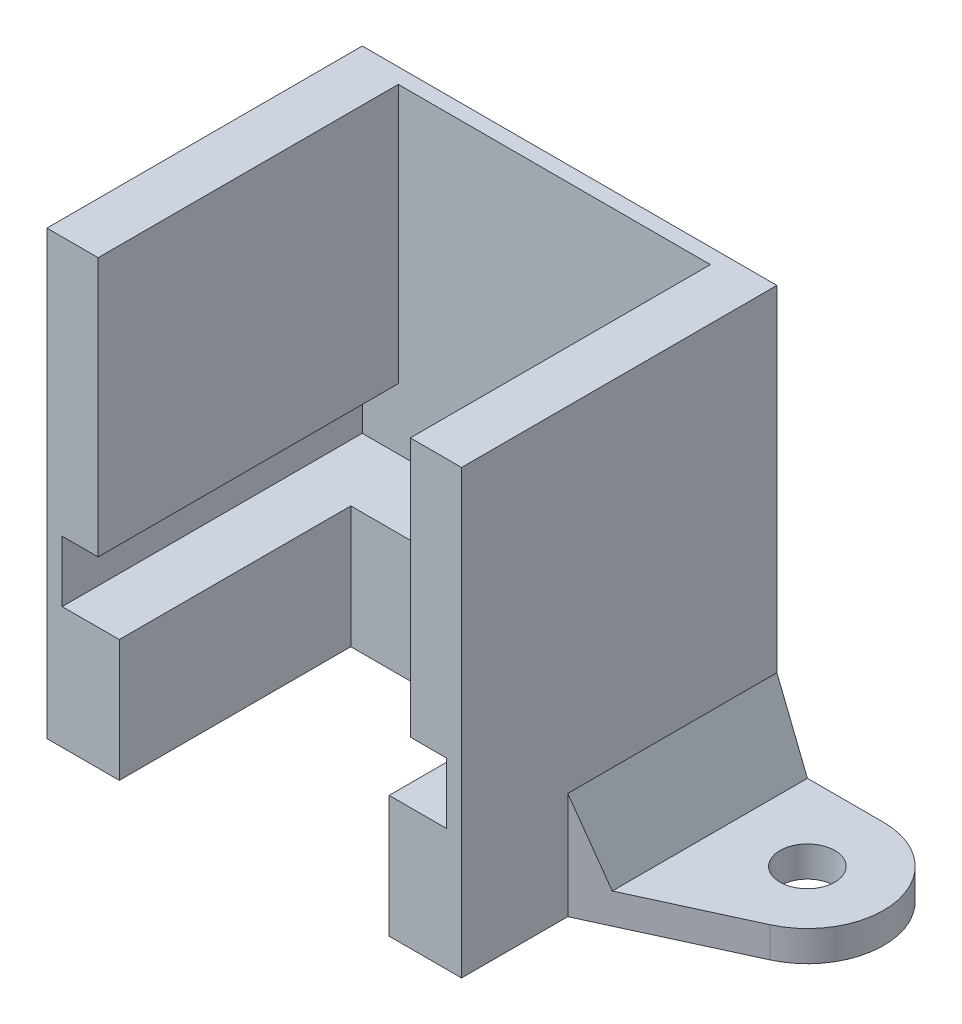
ISO-10303-21;
HEADER;
FILE_DESCRIPTION(('STEP AP214'),'2;1');
FILE_NAME('part.step','',(''),(''),'','','');
FILE_SCHEMA(('AUTOMOTIVE_DESIGN { 1 0 10303 214 1 1 1 1 }'));
ENDSEC;
DATA;
#1=APPLICATION_CONTEXT('core data for automotive mechanical design processes');
#2=APPLICATION_PROTOCOL_DEFINITION('international standard','automotive_design',2000,#1);
#3=PRODUCT_CONTEXT('',#1,'mechanical');
#4=PRODUCT('Part','Part','',(#3));
#5=PRODUCT_RELATED_PRODUCT_CATEGORY('part','',(#4));
#6=PRODUCT_DEFINITION_FORMATION('','',#4);
#7=PRODUCT_DEFINITION_CONTEXT('part definition',#1,'design');
#8=PRODUCT_DEFINITION('design','',#6,#7);
#9=PRODUCT_DEFINITION_SHAPE('','',#8);
#10=(LENGTH_UNIT() NAMED_UNIT(*) SI_UNIT(.MILLI.,.METRE.));
#11=(NAMED_UNIT(*) PLANE_ANGLE_UNIT() SI_UNIT($,.RADIAN.));
#12=(NAMED_UNIT(*) SI_UNIT($,.STERADIAN.) SOLID_ANGLE_UNIT());
#13=UNCERTAINTY_MEASURE_WITH_UNIT(LENGTH_MEASURE(1.E-05),#10,'distance_accuracy_value','');
#14=(GEOMETRIC_REPRESENTATION_CONTEXT(3) GLOBAL_UNCERTAINTY_ASSIGNED_CONTEXT((#13)) GLOBAL_UNIT_ASSIGNED_CONTEXT((#10,
#11,#12)) REPRESENTATION_CONTEXT('',''));
#15=CARTESIAN_POINT('',(0.,0.,0.));
#16=DIRECTION('',(0.,0.,1.));
#17=DIRECTION('',(1.,0.,0.));
#18=AXIS2_PLACEMENT_3D('',#15,#16,#17);
#19=CARTESIAN_POINT('',(0.,0.,0.234999999999994));
#20=DIRECTION('',(0.,0.,1.));
#21=DIRECTION('',(1.,0.,0.));
#22=AXIS2_PLACEMENT_3D('',#19,#20,#21);
#23=PLANE('',#22);
#24=DIRECTION('',(0.,-1.,0.));
#25=VECTOR('',#24,1.);
#26=CARTESIAN_POINT('',(-17.27,10.16,0.234999999999996));
#27=LINE('',#26,#25);
#28=CARTESIAN_POINT('',(-17.27,36.83,0.234999999999985));
#29=VERTEX_POINT('',#28);
#30=CARTESIAN_POINT('',(-17.27,0.,0.234999999999989));
#31=VERTEX_POINT('',#30);
#32=EDGE_CURVE('E399',#29,#31,#27,.T.);
#33=ORIENTED_EDGE('',*,*,#32,.T.);
#34=DIRECTION('',(1.,0.,0.));
#35=VECTOR('',#34,1.);
#36=CARTESIAN_POINT('',(0.,0.,0.234999999999994));
#37=LINE('',#36,#35);
#38=CARTESIAN_POINT('',(-11.2395,0.,0.234999999999996));
#39=VERTEX_POINT('',#38);
#40=EDGE_CURVE('E401',#31,#39,#37,.T.);
#41=ORIENTED_EDGE('',*,*,#40,.T.);
#42=DIRECTION('',(0.,-1.,0.));
#43=VECTOR('',#42,1.);
#44=CARTESIAN_POINT('',(-11.2395,10.16,0.234999999999996));
#45=LINE('',#44,#43);
#46=CARTESIAN_POINT('',(-11.2395,10.16,0.234999999999996));
#47=VERTEX_POINT('',#46);
#48=EDGE_CURVE('E389',#47,#39,#45,.T.);
#49=ORIENTED_EDGE('',*,*,#48,.F.);
#50=DIRECTION('',(1.,0.,0.));
#51=VECTOR('',#50,1.);
#52=CARTESIAN_POINT('',(0.,10.16,0.234999999999994));
#53=LINE('',#52,#51);
#54=CARTESIAN_POINT('',(-16.,10.16,0.234999999999992));
#55=VERTEX_POINT('',#54);
#56=EDGE_CURVE('E394',#55,#47,#53,.T.);
#57=ORIENTED_EDGE('',*,*,#56,.F.);
#58=DIRECTION('',(0.,-1.,0.));
#59=VECTOR('',#58,1.);
#60=CARTESIAN_POINT('',(-16.,15.24,0.234999999999992));
#61=LINE('',#60,#59);
#62=CARTESIAN_POINT('',(-16.,15.24,0.234999999999992));
#63=VERTEX_POINT('',#62);
#64=EDGE_CURVE('E240',#63,#55,#61,.T.);
#65=ORIENTED_EDGE('',*,*,#64,.F.);
#66=DIRECTION('',(1.,0.,0.));
#67=VECTOR('',#66,1.);
#68=CARTESIAN_POINT('',(0.,15.24,0.234999999999994));
#69=LINE('',#68,#67);
#70=CARTESIAN_POINT('',(-13.,15.24,0.234999999999985));
#71=VERTEX_POINT('',#70);
#72=EDGE_CURVE('E245',#63,#71,#69,.T.);
#73=ORIENTED_EDGE('',*,*,#72,.T.);
#74=DIRECTION('',(0.,-1.,0.));
#75=VECTOR('',#74,1.);
#76=CARTESIAN_POINT('',(-13.,36.83,0.234999999999992));
#77=LINE('',#76,#75);
#78=CARTESIAN_POINT('',(-13.,36.83,0.234999999999985));
#79=VERTEX_POINT('',#78);
#80=EDGE_CURVE('E383',#79,#71,#77,.T.);
#81=ORIENTED_EDGE('',*,*,#80,.F.);
#82=DIRECTION('',(1.,0.,0.));
#83=VECTOR('',#82,1.);
#84=CARTESIAN_POINT('',(0.,36.83,0.234999999999994));
#85=LINE('',#84,#83);
#86=EDGE_CURVE('E239',#29,#79,#85,.T.);
#87=ORIENTED_EDGE('',*,*,#86,.F.);
#88=EDGE_LOOP('',(#33,#41,#49,#57,#65,#73,#81,#87));
#89=FACE_BOUND('',#88,.T.);
#90=ADVANCED_FACE('F34',(#89),#23,.T.);
#91=DIRECTION('',(0.,1.,0.));
#92=VECTOR('',#91,1.);
#93=CARTESIAN_POINT('',(11.2395,10.16,0.234999999999996));
#94=LINE('',#93,#92);
#95=CARTESIAN_POINT('',(11.2395,0.,0.234999999999996));
#96=VERTEX_POINT('',#95);
#97=CARTESIAN_POINT('',(11.2395,10.16,0.234999999999996));
#98=VERTEX_POINT('',#97);
#99=EDGE_CURVE('E391',#96,#98,#94,.T.);
#100=ORIENTED_EDGE('',*,*,#99,.F.);
#101=CARTESIAN_POINT('',(17.27,0.,0.234999999999985));
#102=VERTEX_POINT('',#101);
#103=EDGE_CURVE('E248',#96,#102,#37,.T.);
#104=ORIENTED_EDGE('',*,*,#103,.T.);
#105=DIRECTION('',(0.,1.,0.));
#106=VECTOR('',#105,1.);
#107=CARTESIAN_POINT('',(17.27,10.16,0.234999999999992));
#108=LINE('',#107,#106);
#109=CARTESIAN_POINT('',(17.27,36.83,0.234999999999985));
#110=VERTEX_POINT('',#109);
#111=EDGE_CURVE('E397',#102,#110,#108,.T.);
#112=ORIENTED_EDGE('',*,*,#111,.T.);
#113=CARTESIAN_POINT('',(13.,36.83,0.234999999999985));
#114=VERTEX_POINT('',#113);
#115=EDGE_CURVE('E385',#114,#110,#85,.T.);
#116=ORIENTED_EDGE('',*,*,#115,.F.);
#117=DIRECTION('',(0.,1.,0.));
#118=VECTOR('',#117,1.);
#119=CARTESIAN_POINT('',(13.,36.83,0.234999999999992));
#120=LINE('',#119,#118);
#121=CARTESIAN_POINT('',(13.,15.24,0.234999999999985));
#122=VERTEX_POINT('',#121);
#123=EDGE_CURVE('E244',#122,#114,#120,.T.);
#124=ORIENTED_EDGE('',*,*,#123,.F.);
#125=CARTESIAN_POINT('',(16.,15.24,0.234999999999992));
#126=VERTEX_POINT('',#125);
#127=EDGE_CURVE('E222',#122,#126,#69,.T.);
#128=ORIENTED_EDGE('',*,*,#127,.T.);
#129=DIRECTION('',(0.,1.,0.));
#130=VECTOR('',#129,1.);
#131=CARTESIAN_POINT('',(16.,15.24,0.234999999999992));
#132=LINE('',#131,#130);
#133=CARTESIAN_POINT('',(16.,10.16,0.234999999999992));
#134=VERTEX_POINT('',#133);
#135=EDGE_CURVE('E233',#134,#126,#132,.T.);
#136=ORIENTED_EDGE('',*,*,#135,.F.);
#137=EDGE_CURVE('E393',#98,#134,#53,.T.);
#138=ORIENTED_EDGE('',*,*,#137,.F.);
#139=EDGE_LOOP('',(#100,#104,#112,#116,#124,#128,#136,#138));
#140=FACE_BOUND('',#139,.T.);
#141=ADVANCED_FACE('F242',(#140),#23,.T.);
#142=CARTESIAN_POINT('',(0.,2.54,0.));
#143=DIRECTION('',(0.,1.,0.));
#144=DIRECTION('',(0.,0.,1.));
#145=AXIS2_PLACEMENT_3D('',#142,#143,#144);
#146=PLANE('',#145);
#147=CARTESIAN_POINT('',(26.16,2.54,-19.685));
#148=DIRECTION('',(0.,1.,0.));
#149=DIRECTION('',(0.,0.,1.));
#150=AXIS2_PLACEMENT_3D('',#147,#148,#149);
#151=CIRCLE('',#150,2.286);
#152=CARTESIAN_POINT('',(26.16,2.54,-17.399));
#153=VERTEX_POINT('',#152);
#154=EDGE_CURVE('E360',#153,#153,#151,.T.);
#155=ORIENTED_EDGE('',*,*,#154,.F.);
#156=EDGE_LOOP('',(#155));
#157=FACE_BOUND('',#156,.T.);
#158=DIRECTION('',(-1.,0.,0.));
#159=VECTOR('',#158,1.);
#160=CARTESIAN_POINT('',(0.,2.54,-26.035));
#161=LINE('',#160,#159);
#162=CARTESIAN_POINT('',(26.16,2.54,-26.035));
#163=VERTEX_POINT('',#162);
#164=CARTESIAN_POINT('',(19.81,2.54,-26.035));
#165=VERTEX_POINT('',#164);
#166=EDGE_CURVE('E344',#163,#165,#161,.T.);
#167=ORIENTED_EDGE('',*,*,#166,.T.);
#168=DIRECTION('',(0.,0.,1.));
#169=VECTOR('',#168,1.);
#170=CARTESIAN_POINT('',(19.81,2.54,0.));
#171=LINE('',#170,#169);
#172=CARTESIAN_POINT('',(19.81,2.54,-9.78016528475278));
#173=VERTEX_POINT('',#172);
#174=EDGE_CURVE('E779',#165,#173,#171,.T.);
#175=ORIENTED_EDGE('',*,*,#174,.T.);
#176=DIRECTION('',(-0.908711915483254,0.,0.417423830966508));
#177=VECTOR('',#176,1.);
#178=CARTESIAN_POINT('',(-0.258045834771422,2.54,-0.561753564128513));
#179=LINE('',#178,#177);
#180=CARTESIAN_POINT('',(28.8106413266373,2.54,-13.9146793366813));
#181=VERTEX_POINT('',#180);
#182=EDGE_CURVE('E349',#181,#173,#179,.T.);
#183=ORIENTED_EDGE('',*,*,#182,.F.);
#184=CARTESIAN_POINT('',(26.16,2.54,-19.685));
#185=DIRECTION('',(0.,1.,0.));
#186=DIRECTION('',(0.,0.,1.));
#187=AXIS2_PLACEMENT_3D('',#184,#185,#186);
#188=CIRCLE('',#187,6.35000000000001);
#189=EDGE_CURVE('E354',#181,#163,#188,.T.);
#190=ORIENTED_EDGE('',*,*,#189,.T.);
#191=EDGE_LOOP('',(#167,#175,#183,#190));
#192=FACE_BOUND('',#191,.T.);
#193=ADVANCED_FACE('F483',(#157,#192),#146,.T.);
#194=CARTESIAN_POINT('',(0.,2.54,0.));
#195=DIRECTION('',(0.,1.,0.));
#196=DIRECTION('',(0.,0.,1.));
#197=AXIS2_PLACEMENT_3D('',#194,#195,#196);
#198=PLANE('',#197);
#199=DIRECTION('',(0.,0.,1.));
#200=VECTOR('',#199,1.);
#201=CARTESIAN_POINT('',(-19.81,2.54,0.));
#202=LINE('',#201,#200);
#203=CARTESIAN_POINT('',(-19.81,2.54,-26.035));
#204=VERTEX_POINT('',#203);
#205=CARTESIAN_POINT('',(-19.81,2.54,-9.78016528475278));
#206=VERTEX_POINT('',#205);
#207=EDGE_CURVE('E382',#204,#206,#202,.T.);
#208=ORIENTED_EDGE('',*,*,#207,.F.);
#209=DIRECTION('',(1.,0.,0.));
#210=VECTOR('',#209,1.);
#211=CARTESIAN_POINT('',(0.,2.54,-26.035));
#212=LINE('',#211,#210);
#213=CARTESIAN_POINT('',(-26.16,2.54,-26.035));
#214=VERTEX_POINT('',#213);
#215=EDGE_CURVE('E328',#214,#204,#212,.T.);
#216=ORIENTED_EDGE('',*,*,#215,.F.);
#217=CARTESIAN_POINT('',(-26.16,2.54,-19.685));
#218=DIRECTION('',(0.,1.,0.));
#219=DIRECTION('',(0.,0.,1.));
#220=AXIS2_PLACEMENT_3D('',#217,#218,#219);
#221=CIRCLE('',#220,6.35);
#222=CARTESIAN_POINT('',(-28.8106413266373,2.54,-13.9146793366814));
#223=VERTEX_POINT('',#222);
#224=EDGE_CURVE('E333',#223,#214,#221,.F.);
#225=ORIENTED_EDGE('',*,*,#224,.F.);
#226=DIRECTION('',(0.908711915483254,0.,0.417423830966509));
#227=VECTOR('',#226,1.);
#228=CARTESIAN_POINT('',(0.258045834771423,2.54,-0.561753564128515));
#229=LINE('',#228,#227);
#230=EDGE_CURVE('E324',#223,#206,#229,.T.);
#231=ORIENTED_EDGE('',*,*,#230,.T.);
#232=EDGE_LOOP('',(#208,#216,#225,#231));
#233=FACE_BOUND('',#232,.T.);
#234=CARTESIAN_POINT('',(-26.16,2.54,-19.685));
#235=DIRECTION('',(0.,1.,0.));
#236=DIRECTION('',(0.,0.,-1.));
#237=AXIS2_PLACEMENT_3D('',#234,#235,#236);
#238=CIRCLE('',#237,2.286);
#239=CARTESIAN_POINT('',(-26.16,2.54,-21.971));
#240=VERTEX_POINT('',#239);
#241=EDGE_CURVE('E366',#240,#240,#238,.T.);
#242=ORIENTED_EDGE('',*,*,#241,.F.);
#243=EDGE_LOOP('',(#242));
#244=FACE_BOUND('',#243,.T.);
#245=ADVANCED_FACE('F485',(#233,#244),#198,.T.);
#246=CARTESIAN_POINT('',(5.715,1.27,-38.5430494082811));
#247=DIRECTION('',(1.,0.,0.));
#248=DIRECTION('',(0.,0.,-1.));
#249=AXIS2_PLACEMENT_3D('',#246,#247,#248);
#250=PLANE('',#249);
#251=DIRECTION('',(0.,1.,0.));
#252=VECTOR('',#251,1.);
#253=CARTESIAN_POINT('',(5.715,10.16,-19.05));
#254=LINE('',#253,#252);
#255=CARTESIAN_POINT('',(5.715,1.27,-19.05));
#256=VERTEX_POINT('',#255);
#257=CARTESIAN_POINT('',(5.715,6.35,-19.05));
#258=VERTEX_POINT('',#257);
#259=EDGE_CURVE('E446',#256,#258,#254,.T.);
#260=ORIENTED_EDGE('',*,*,#259,.T.);
#261=DIRECTION('',(0.,0.,1.));
#262=VECTOR('',#261,1.);
#263=CARTESIAN_POINT('',(5.715,6.35,-38.5430494082811));
#264=LINE('',#263,#262);
#265=CARTESIAN_POINT('',(5.715,6.35,-26.035));
#266=VERTEX_POINT('',#265);
#267=EDGE_CURVE('E300',#266,#258,#264,.T.);
#268=ORIENTED_EDGE('',*,*,#267,.F.);
#269=DIRECTION('',(0.,-1.,0.));
#270=VECTOR('',#269,1.);
#271=CARTESIAN_POINT('',(5.715,1.27,-26.035));
#272=LINE('',#271,#270);
#273=CARTESIAN_POINT('',(5.715,1.27,-26.035));
#274=VERTEX_POINT('',#273);
#275=EDGE_CURVE('E301',#266,#274,#272,.T.);
#276=ORIENTED_EDGE('',*,*,#275,.T.);
#277=DIRECTION('',(0.,0.,1.));
#278=VECTOR('',#277,1.);
#279=CARTESIAN_POINT('',(5.715,1.27,-38.5430494082811));
#280=LINE('',#279,#278);
#281=EDGE_CURVE('E303',#274,#256,#280,.T.);
#282=ORIENTED_EDGE('',*,*,#281,.T.);
#283=EDGE_LOOP('',(#260,#268,#276,#282));
#284=FACE_BOUND('',#283,.T.);
#285=ADVANCED_FACE('F460',(#284),#250,.F.);
#286=CARTESIAN_POINT('',(-5.715,1.27,-38.5430494082811));
#287=DIRECTION('',(0.,-1.,0.));
#288=DIRECTION('',(1.,0.,0.));
#289=AXIS2_PLACEMENT_3D('',#286,#287,#288);
#290=PLANE('',#289);
#291=DIRECTION('',(1.,0.,0.));
#292=VECTOR('',#291,1.);
#293=CARTESIAN_POINT('',(-11.2395,1.27,-19.05));
#294=LINE('',#293,#292);
#295=CARTESIAN_POINT('',(-5.715,1.27,-19.05));
#296=VERTEX_POINT('',#295);
#297=EDGE_CURVE('E448',#296,#256,#294,.T.);
#298=ORIENTED_EDGE('',*,*,#297,.T.);
#299=ORIENTED_EDGE('',*,*,#281,.F.);
#300=DIRECTION('',(-1.,0.,0.));
#301=VECTOR('',#300,1.);
#302=CARTESIAN_POINT('',(-5.715,1.27,-26.035));
#303=LINE('',#302,#301);
#304=CARTESIAN_POINT('',(-5.715,1.27,-26.035));
#305=VERTEX_POINT('',#304);
#306=EDGE_CURVE('E450',#274,#305,#303,.T.);
#307=ORIENTED_EDGE('',*,*,#306,.T.);
#308=DIRECTION('',(0.,0.,1.));
#309=VECTOR('',#308,1.);
#310=CARTESIAN_POINT('',(-5.715,1.27,-38.5430494082811));
#311=LINE('',#310,#309);
#312=EDGE_CURVE('E38',#305,#296,#311,.T.);
#313=ORIENTED_EDGE('',*,*,#312,.T.);
#314=EDGE_LOOP('',(#298,#299,#307,#313));
#315=FACE_BOUND('',#314,.T.);
#316=ADVANCED_FACE('F465',(#315),#290,.F.);
#317=CARTESIAN_POINT('',(-5.715,1.27,-38.5430494082811));
#318=DIRECTION('',(-1.,0.,0.));
#319=DIRECTION('',(0.,0.,1.));
#320=AXIS2_PLACEMENT_3D('',#317,#318,#319);
#321=PLANE('',#320);
#322=DIRECTION('',(0.,-1.,0.));
#323=VECTOR('',#322,1.);
#324=CARTESIAN_POINT('',(-5.715,10.16,-19.05));
#325=LINE('',#324,#323);
#326=CARTESIAN_POINT('',(-5.715,6.35,-19.05));
#327=VERTEX_POINT('',#326);
#328=EDGE_CURVE('E296',#327,#296,#325,.T.);
#329=ORIENTED_EDGE('',*,*,#328,.T.);
#330=ORIENTED_EDGE('',*,*,#312,.F.);
#331=DIRECTION('',(0.,1.,0.));
#332=VECTOR('',#331,1.);
#333=CARTESIAN_POINT('',(-5.715,1.27,-26.035));
#334=LINE('',#333,#332);
#335=CARTESIAN_POINT('',(-5.715,6.35,-26.035));
#336=VERTEX_POINT('',#335);
#337=EDGE_CURVE('E452',#305,#336,#334,.T.);
#338=ORIENTED_EDGE('',*,*,#337,.T.);
#339=DIRECTION('',(0.,0.,1.));
#340=VECTOR('',#339,1.);
#341=CARTESIAN_POINT('',(-5.715,6.35,-38.5430494082811));
#342=LINE('',#341,#340);
#343=EDGE_CURVE('E297',#336,#327,#342,.T.);
#344=ORIENTED_EDGE('',*,*,#343,.T.);
#345=EDGE_LOOP('',(#329,#330,#338,#344));
#346=FACE_BOUND('',#345,.T.);
#347=ADVANCED_FACE('F36',(#346),#321,.F.);
#348=CARTESIAN_POINT('',(-5.715,6.35,-38.5430494082811));
#349=DIRECTION('',(0.,1.,0.));
#350=DIRECTION('',(-1.,0.,0.));
#351=AXIS2_PLACEMENT_3D('',#348,#349,#350);
#352=PLANE('',#351);
#353=DIRECTION('',(-1.,0.,0.));
#354=VECTOR('',#353,1.);
#355=CARTESIAN_POINT('',(-11.2395,6.35,-19.05));
#356=LINE('',#355,#354);
#357=EDGE_CURVE('E444',#258,#327,#356,.T.);
#358=ORIENTED_EDGE('',*,*,#357,.T.);
#359=ORIENTED_EDGE('',*,*,#343,.F.);
#360=DIRECTION('',(1.,0.,0.));
#361=VECTOR('',#360,1.);
#362=CARTESIAN_POINT('',(-5.715,6.35,-26.035));
#363=LINE('',#362,#361);
#364=EDGE_CURVE('E453',#336,#266,#363,.T.);
#365=ORIENTED_EDGE('',*,*,#364,.T.);
#366=ORIENTED_EDGE('',*,*,#267,.T.);
#367=EDGE_LOOP('',(#358,#359,#365,#366));
#368=FACE_BOUND('',#367,.T.);
#369=ADVANCED_FACE('F472',(#368),#352,.F.);
#370=CARTESIAN_POINT('',(17.27,8.89,-8.61339679400001));
#371=DIRECTION('',(-0.928476690885261,-0.371390676354101,0.));
#372=DIRECTION('',(0.371390676354101,-0.928476690885261,0.));
#373=AXIS2_PLACEMENT_3D('',#370,#371,#372);
#374=PLANE('',#373);
#375=DIRECTION('',(-0.366101243764277,0.915253109410701,0.168171415610062));
#376=VECTOR('',#375,1.);
#377=CARTESIAN_POINT('',(17.27,8.89,-8.61339679400002));
#378=LINE('',#377,#376);
#379=CARTESIAN_POINT('',(17.27,8.89,-8.61339679400001));
#380=VERTEX_POINT('',#379);
#381=EDGE_CURVE('E374',#173,#380,#378,.T.);
#382=ORIENTED_EDGE('',*,*,#381,.F.);
#383=ORIENTED_EDGE('',*,*,#174,.F.);
#384=DIRECTION('',(-0.371390676354101,0.928476690885261,0.));
#385=VECTOR('',#384,1.);
#386=CARTESIAN_POINT('',(17.27,8.89,-26.035));
#387=LINE('',#386,#385);
#388=CARTESIAN_POINT('',(17.27,8.89000000000001,-26.035));
#389=VERTEX_POINT('',#388);
#390=EDGE_CURVE('E371',#165,#389,#387,.T.);
#391=ORIENTED_EDGE('',*,*,#390,.T.);
#392=DIRECTION('',(0.,0.,-1.));
#393=VECTOR('',#392,1.);
#394=CARTESIAN_POINT('',(17.27,8.89,-8.61339679400001));
#395=LINE('',#394,#393);
#396=EDGE_CURVE('E369',#380,#389,#395,.T.);
#397=ORIENTED_EDGE('',*,*,#396,.F.);
#398=EDGE_LOOP('',(#382,#383,#391,#397));
#399=FACE_BOUND('',#398,.T.);
#400=ADVANCED_FACE('F474',(#399),#374,.F.);
#401=CARTESIAN_POINT('',(-17.27,8.89,-8.61339679400001));
#402=DIRECTION('',(-0.928476690885261,0.371390676354101,0.));
#403=DIRECTION('',(-0.371390676354101,-0.928476690885261,0.));
#404=AXIS2_PLACEMENT_3D('',#401,#402,#403);
#405=PLANE('',#404);
#406=DIRECTION('',(-0.366101243764277,-0.915253109410701,-0.168171415610062));
#407=VECTOR('',#406,1.);
#408=CARTESIAN_POINT('',(-17.27,8.89,-8.61339679400002));
#409=LINE('',#408,#407);
#410=CARTESIAN_POINT('',(-17.27,8.89,-8.61339679400001));
#411=VERTEX_POINT('',#410);
#412=EDGE_CURVE('E11',#411,#206,#409,.T.);
#413=ORIENTED_EDGE('',*,*,#412,.F.);
#414=DIRECTION('',(0.,0.,-1.));
#415=VECTOR('',#414,1.);
#416=CARTESIAN_POINT('',(-17.27,8.89,-8.61339679400001));
#417=LINE('',#416,#415);
#418=CARTESIAN_POINT('',(-17.27,8.89,-26.035));
#419=VERTEX_POINT('',#418);
#420=EDGE_CURVE('E377',#411,#419,#417,.T.);
#421=ORIENTED_EDGE('',*,*,#420,.T.);
#422=DIRECTION('',(0.371390676354101,0.928476690885261,0.));
#423=VECTOR('',#422,1.);
#424=CARTESIAN_POINT('',(-17.27,8.89,-26.035));
#425=LINE('',#424,#423);
#426=EDGE_CURVE('E43',#204,#419,#425,.T.);
#427=ORIENTED_EDGE('',*,*,#426,.F.);
#428=ORIENTED_EDGE('',*,*,#207,.T.);
#429=EDGE_LOOP('',(#413,#421,#427,#428));
#430=FACE_BOUND('',#429,.T.);
#431=ADVANCED_FACE('F479',(#430),#405,.T.);
#432=CARTESIAN_POINT('',(-0.258045834771422,2.54,-0.561753564128513));
#433=DIRECTION('',(0.417423830966508,0.,0.908711915483253));
#434=DIRECTION('',(0.908711915483254,0.,-0.417423830966508));
#435=AXIS2_PLACEMENT_3D('',#432,#433,#434);
#436=PLANE('',#435);
#437=DIRECTION('',(-0.908711915483254,0.,0.417423830966508));
#438=VECTOR('',#437,1.);
#439=CARTESIAN_POINT('',(-0.258045834771422,0.,-0.561753564128513));
#440=LINE('',#439,#438);
#441=CARTESIAN_POINT('',(28.8106413266373,0.,-13.9146793366813));
#442=VERTEX_POINT('',#441);
#443=CARTESIAN_POINT('',(17.27,0.,-8.6133966834067));
#444=VERTEX_POINT('',#443);
#445=EDGE_CURVE('E348',#442,#444,#440,.T.);
#446=ORIENTED_EDGE('',*,*,#445,.F.);
#447=DIRECTION('',(0.,-1.,0.));
#448=VECTOR('',#447,1.);
#449=CARTESIAN_POINT('',(28.8106413266373,2.54,-13.9146793366813));
#450=LINE('',#449,#448);
#451=EDGE_CURVE('E330',#181,#442,#450,.T.);
#452=ORIENTED_EDGE('',*,*,#451,.F.);
#453=ORIENTED_EDGE('',*,*,#182,.T.);
#454=ORIENTED_EDGE('',*,*,#381,.T.);
#455=DIRECTION('',(0.,-1.,0.));
#456=VECTOR('',#455,1.);
#457=CARTESIAN_POINT('',(17.27,2.54,-8.6133966834067));
#458=LINE('',#457,#456);
#459=EDGE_CURVE('E341',#380,#444,#458,.T.);
#460=ORIENTED_EDGE('',*,*,#459,.T.);
#461=EDGE_LOOP('',(#446,#452,#453,#454,#460));
#462=FACE_BOUND('',#461,.T.);
#463=ADVANCED_FACE('F511',(#462),#436,.T.);
#464=CARTESIAN_POINT('',(26.16,2.54,-19.685));
#465=DIRECTION('',(0.,-1.,0.));
#466=DIRECTION('',(0.,0.,-1.));
#467=AXIS2_PLACEMENT_3D('',#464,#465,#466);
#468=CYLINDRICAL_SURFACE('',#467,6.35000000000001);
#469=CARTESIAN_POINT('',(26.16,0.,-19.685));
#470=DIRECTION('',(0.,1.,0.));
#471=DIRECTION('',(0.,0.,1.));
#472=AXIS2_PLACEMENT_3D('',#469,#470,#471);
#473=CIRCLE('',#472,6.35000000000001);
#474=CARTESIAN_POINT('',(26.16,0.,-26.035));
#475=VERTEX_POINT('',#474);
#476=EDGE_CURVE('E345',#442,#475,#473,.T.);
#477=ORIENTED_EDGE('',*,*,#476,.T.);
#478=DIRECTION('',(0.,-1.,0.));
#479=VECTOR('',#478,1.);
#480=CARTESIAN_POINT('',(26.16,2.54,-26.035));
#481=LINE('',#480,#479);
#482=EDGE_CURVE('E338',#163,#475,#481,.T.);
#483=ORIENTED_EDGE('',*,*,#482,.F.);
#484=ORIENTED_EDGE('',*,*,#189,.F.);
#485=ORIENTED_EDGE('',*,*,#451,.T.);
#486=EDGE_LOOP('',(#477,#483,#484,#485));
#487=FACE_BOUND('',#486,.T.);
#488=ADVANCED_FACE('F499',(#487),#468,.T.);
#489=CARTESIAN_POINT('',(-26.16,2.54,-19.685));
#490=DIRECTION('',(0.,-1.,0.));
#491=DIRECTION('',(0.,0.,-1.));
#492=AXIS2_PLACEMENT_3D('',#489,#490,#491);
#493=CYLINDRICAL_SURFACE('',#492,6.35);
#494=CARTESIAN_POINT('',(-26.16,0.,-19.685));
#495=DIRECTION('',(0.,1.,0.));
#496=DIRECTION('',(0.,0.,1.));
#497=AXIS2_PLACEMENT_3D('',#494,#495,#496);
#498=CIRCLE('',#497,6.35);
#499=CARTESIAN_POINT('',(-28.8106413266373,0.,-13.9146793366814));
#500=VERTEX_POINT('',#499);
#501=CARTESIAN_POINT('',(-26.16,0.,-26.035));
#502=VERTEX_POINT('',#501);
#503=EDGE_CURVE('E327',#500,#502,#498,.F.);
#504=ORIENTED_EDGE('',*,*,#503,.F.);
#505=DIRECTION('',(0.,-1.,0.));
#506=VECTOR('',#505,1.);
#507=CARTESIAN_POINT('',(-28.8106413266373,2.54,-13.9146793366814));
#508=LINE('',#507,#506);
#509=EDGE_CURVE('E313',#223,#500,#508,.T.);
#510=ORIENTED_EDGE('',*,*,#509,.F.);
#511=ORIENTED_EDGE('',*,*,#224,.T.);
#512=DIRECTION('',(0.,-1.,0.));
#513=VECTOR('',#512,1.);
#514=CARTESIAN_POINT('',(-26.16,2.54,-26.035));
#515=LINE('',#514,#513);
#516=EDGE_CURVE('E308',#214,#502,#515,.T.);
#517=ORIENTED_EDGE('',*,*,#516,.T.);
#518=EDGE_LOOP('',(#504,#510,#511,#517));
#519=FACE_BOUND('',#518,.T.);
#520=ADVANCED_FACE('F607',(#519),#493,.T.);
#521=CARTESIAN_POINT('',(0.258045834771423,2.54,-0.561753564128515));
#522=DIRECTION('',(0.417423830966509,0.,-0.908711915483253));
#523=DIRECTION('',(-0.908711915483254,0.,-0.417423830966509));
#524=AXIS2_PLACEMENT_3D('',#521,#522,#523);
#525=PLANE('',#524);
#526=DIRECTION('',(0.908711915483254,0.,0.417423830966509));
#527=VECTOR('',#526,1.);
#528=CARTESIAN_POINT('',(0.258045834771423,0.,-0.561753564128515));
#529=LINE('',#528,#527);
#530=CARTESIAN_POINT('',(-17.27,0.,-8.61339668340671));
#531=VERTEX_POINT('',#530);
#532=EDGE_CURVE('E325',#500,#531,#529,.T.);
#533=ORIENTED_EDGE('',*,*,#532,.T.);
#534=DIRECTION('',(0.,-1.,0.));
#535=VECTOR('',#534,1.);
#536=CARTESIAN_POINT('',(-17.27,2.54,-8.6133966834067));
#537=LINE('',#536,#535);
#538=EDGE_CURVE('E54',#411,#531,#537,.T.);
#539=ORIENTED_EDGE('',*,*,#538,.F.);
#540=ORIENTED_EDGE('',*,*,#412,.T.);
#541=ORIENTED_EDGE('',*,*,#230,.F.);
#542=ORIENTED_EDGE('',*,*,#509,.T.);
#543=EDGE_LOOP('',(#533,#539,#540,#541,#542));
#544=FACE_BOUND('',#543,.T.);
#545=ADVANCED_FACE('F507',(#544),#525,.F.);
#546=CARTESIAN_POINT('',(-26.16,-6.46578440716979,-19.685));
#547=DIRECTION('',(0.,1.,0.));
#548=DIRECTION('',(0.,0.,1.));
#549=AXIS2_PLACEMENT_3D('',#546,#547,#548);
#550=CYLINDRICAL_SURFACE('',#549,2.286);
#551=CARTESIAN_POINT('',(-26.16,0.,-19.685));
#552=DIRECTION('',(0.,1.,0.));
#553=DIRECTION('',(0.,0.,1.));
#554=AXIS2_PLACEMENT_3D('',#551,#552,#553);
#555=CIRCLE('',#554,2.286);
#556=CARTESIAN_POINT('',(-26.16,0.,-17.399));
#557=VERTEX_POINT('',#556);
#558=EDGE_CURVE('E363',#557,#557,#555,.F.);
#559=ORIENTED_EDGE('',*,*,#558,.T.);
#560=EDGE_LOOP('',(#559));
#561=FACE_BOUND('',#560,.T.);
#562=ORIENTED_EDGE('',*,*,#241,.T.);
#563=EDGE_LOOP('',(#562));
#564=FACE_BOUND('',#563,.T.);
#565=ADVANCED_FACE('F504',(#561,#564),#550,.F.);
#566=CARTESIAN_POINT('',(26.16,-6.46578440716979,-19.685));
#567=DIRECTION('',(0.,1.,0.));
#568=DIRECTION('',(0.,0.,1.));
#569=AXIS2_PLACEMENT_3D('',#566,#567,#568);
#570=CYLINDRICAL_SURFACE('',#569,2.286);
#571=CARTESIAN_POINT('',(26.16,0.,-19.685));
#572=DIRECTION('',(0.,1.,0.));
#573=DIRECTION('',(0.,0.,1.));
#574=AXIS2_PLACEMENT_3D('',#571,#572,#573);
#575=CIRCLE('',#574,2.286);
#576=CARTESIAN_POINT('',(26.16,0.,-17.399));
#577=VERTEX_POINT('',#576);
#578=EDGE_CURVE('E352',#577,#577,#575,.F.);
#579=ORIENTED_EDGE('',*,*,#578,.T.);
#580=EDGE_LOOP('',(#579));
#581=FACE_BOUND('',#580,.T.);
#582=ORIENTED_EDGE('',*,*,#154,.T.);
#583=EDGE_LOOP('',(#582));
#584=FACE_BOUND('',#583,.T.);
#585=ADVANCED_FACE('F501',(#581,#584),#570,.F.);
#586=CARTESIAN_POINT('',(-11.2395,10.16,-19.05));
#587=DIRECTION('',(0.,0.,1.));
#588=DIRECTION('',(1.,0.,0.));
#589=AXIS2_PLACEMENT_3D('',#586,#587,#588);
#590=PLANE('',#589);
#591=ORIENTED_EDGE('',*,*,#328,.F.);
#592=ORIENTED_EDGE('',*,*,#357,.F.);
#593=ORIENTED_EDGE('',*,*,#259,.F.);
#594=ORIENTED_EDGE('',*,*,#297,.F.);
#595=EDGE_LOOP('',(#591,#592,#593,#594));
#596=FACE_BOUND('',#595,.T.);
#597=DIRECTION('',(-1.,0.,0.));
#598=VECTOR('',#597,1.);
#599=CARTESIAN_POINT('',(-11.2395,0.,-19.05));
#600=LINE('',#599,#598);
#601=CARTESIAN_POINT('',(11.2395,0.,-19.05));
#602=VERTEX_POINT('',#601);
#603=CARTESIAN_POINT('',(-11.2395,0.,-19.05));
#604=VERTEX_POINT('',#603);
#605=EDGE_CURVE('E268',#602,#604,#600,.T.);
#606=ORIENTED_EDGE('',*,*,#605,.F.);
#607=DIRECTION('',(0.,-1.,0.));
#608=VECTOR('',#607,1.);
#609=CARTESIAN_POINT('',(11.2395,10.16,-19.05));
#610=LINE('',#609,#608);
#611=CARTESIAN_POINT('',(11.2395,10.16,-19.05));
#612=VERTEX_POINT('',#611);
#613=EDGE_CURVE('E257',#612,#602,#610,.T.);
#614=ORIENTED_EDGE('',*,*,#613,.F.);
#615=DIRECTION('',(-1.,0.,0.));
#616=VECTOR('',#615,1.);
#617=CARTESIAN_POINT('',(-11.2395,10.16,-19.05));
#618=LINE('',#617,#616);
#619=CARTESIAN_POINT('',(-11.2395,10.16,-19.05));
#620=VERTEX_POINT('',#619);
#621=EDGE_CURVE('E261',#612,#620,#618,.T.);
#622=ORIENTED_EDGE('',*,*,#621,.T.);
#623=DIRECTION('',(0.,-1.,0.));
#624=VECTOR('',#623,1.);
#625=CARTESIAN_POINT('',(-11.2395,10.16,-19.05));
#626=LINE('',#625,#624);
#627=EDGE_CURVE('E262',#620,#604,#626,.T.);
#628=ORIENTED_EDGE('',*,*,#627,.T.);
#629=EDGE_LOOP('',(#606,#614,#622,#628));
#630=FACE_BOUND('',#629,.T.);
#631=ADVANCED_FACE('F471',(#596,#630),#590,.T.);
#632=CARTESIAN_POINT('',(0.,0.,0.));
#633=DIRECTION('',(0.,1.,0.));
#634=DIRECTION('',(0.,0.,1.));
#635=AXIS2_PLACEMENT_3D('',#632,#633,#634);
#636=PLANE('',#635);
#637=ORIENTED_EDGE('',*,*,#578,.F.);
#638=EDGE_LOOP('',(#637));
#639=FACE_BOUND('',#638,.T.);
#640=ORIENTED_EDGE('',*,*,#558,.F.);
#641=EDGE_LOOP('',(#640));
#642=FACE_BOUND('',#641,.T.);
#643=ORIENTED_EDGE('',*,*,#40,.F.);
#644=DIRECTION('',(0.,0.,1.));
#645=VECTOR('',#644,1.);
#646=CARTESIAN_POINT('',(-17.27,0.,-26.035));
#647=LINE('',#646,#645);
#648=EDGE_CURVE('E254',#531,#31,#647,.T.);
#649=ORIENTED_EDGE('',*,*,#648,.F.);
#650=ORIENTED_EDGE('',*,*,#532,.F.);
#651=ORIENTED_EDGE('',*,*,#503,.T.);
#652=DIRECTION('',(-1.,0.,0.));
#653=VECTOR('',#652,1.);
#654=CARTESIAN_POINT('',(-17.27,0.,-26.035));
#655=LINE('',#654,#653);
#656=EDGE_CURVE('E255',#475,#502,#655,.T.);
#657=ORIENTED_EDGE('',*,*,#656,.F.);
#658=ORIENTED_EDGE('',*,*,#476,.F.);
#659=ORIENTED_EDGE('',*,*,#445,.T.);
#660=DIRECTION('',(0.,0.,-1.));
#661=VECTOR('',#660,1.);
#662=CARTESIAN_POINT('',(17.27,0.,-26.035));
#663=LINE('',#662,#661);
#664=EDGE_CURVE('E252',#102,#444,#663,.T.);
#665=ORIENTED_EDGE('',*,*,#664,.F.);
#666=ORIENTED_EDGE('',*,*,#103,.F.);
#667=DIRECTION('',(0.,0.,-1.));
#668=VECTOR('',#667,1.);
#669=CARTESIAN_POINT('',(11.2395,0.,19.05));
#670=LINE('',#669,#668);
#671=EDGE_CURVE('E269',#96,#602,#670,.T.);
#672=ORIENTED_EDGE('',*,*,#671,.T.);
#673=ORIENTED_EDGE('',*,*,#605,.T.);
#674=DIRECTION('',(0.,0.,1.));
#675=VECTOR('',#674,1.);
#676=CARTESIAN_POINT('',(-11.2395,0.,19.05));
#677=LINE('',#676,#675);
#678=EDGE_CURVE('E265',#604,#39,#677,.T.);
#679=ORIENTED_EDGE('',*,*,#678,.T.);
#680=EDGE_LOOP('',(#643,#649,#650,#651,#657,#658,#659,#665,#666,#672,#673,#679));
#681=FACE_BOUND('',#680,.T.);
#682=ADVANCED_FACE('F412',(#639,#642,#681),#636,.F.);
#683=CARTESIAN_POINT('',(0.,10.16,0.));
#684=DIRECTION('',(0.,1.,0.));
#685=DIRECTION('',(0.,0.,1.));
#686=AXIS2_PLACEMENT_3D('',#683,#684,#685);
#687=PLANE('',#686);
#688=DIRECTION('',(0.,0.,1.));
#689=VECTOR('',#688,1.);
#690=CARTESIAN_POINT('',(-16.,10.16,-24.765));
#691=LINE('',#690,#689);
#692=CARTESIAN_POINT('',(-16.,10.16,-24.765));
#693=VERTEX_POINT('',#692);
#694=EDGE_CURVE('E275',#693,#55,#691,.T.);
#695=ORIENTED_EDGE('',*,*,#694,.T.);
#696=ORIENTED_EDGE('',*,*,#56,.T.);
#697=DIRECTION('',(0.,0.,1.));
#698=VECTOR('',#697,1.);
#699=CARTESIAN_POINT('',(-11.2395,10.16,19.05));
#700=LINE('',#699,#698);
#701=EDGE_CURVE('E258',#620,#47,#700,.T.);
#702=ORIENTED_EDGE('',*,*,#701,.F.);
#703=ORIENTED_EDGE('',*,*,#621,.F.);
#704=DIRECTION('',(0.,0.,-1.));
#705=VECTOR('',#704,1.);
#706=CARTESIAN_POINT('',(11.2395,10.16,19.05));
#707=LINE('',#706,#705);
#708=EDGE_CURVE('E263',#98,#612,#707,.T.);
#709=ORIENTED_EDGE('',*,*,#708,.F.);
#710=ORIENTED_EDGE('',*,*,#137,.T.);
#711=DIRECTION('',(0.,0.,-1.));
#712=VECTOR('',#711,1.);
#713=CARTESIAN_POINT('',(16.,10.16,-24.765));
#714=LINE('',#713,#712);
#715=CARTESIAN_POINT('',(16.,10.16,-24.765));
#716=VERTEX_POINT('',#715);
#717=EDGE_CURVE('E235',#134,#716,#714,.T.);
#718=ORIENTED_EDGE('',*,*,#717,.T.);
#719=DIRECTION('',(-1.,0.,0.));
#720=VECTOR('',#719,1.);
#721=CARTESIAN_POINT('',(-16.,10.16,-24.765));
#722=LINE('',#721,#720);
#723=EDGE_CURVE('E273',#716,#693,#722,.T.);
#724=ORIENTED_EDGE('',*,*,#723,.T.);
#725=EDGE_LOOP('',(#695,#696,#702,#703,#709,#710,#718,#724));
#726=FACE_BOUND('',#725,.T.);
#727=ADVANCED_FACE('F524',(#726),#687,.T.);
#728=CARTESIAN_POINT('',(-17.27,10.16,-26.035));
#729=DIRECTION('',(0.,0.,1.));
#730=DIRECTION('',(1.,0.,0.));
#731=AXIS2_PLACEMENT_3D('',#728,#729,#730);
#732=PLANE('',#731);
#733=ORIENTED_EDGE('',*,*,#364,.F.);
#734=ORIENTED_EDGE('',*,*,#337,.F.);
#735=ORIENTED_EDGE('',*,*,#306,.F.);
#736=ORIENTED_EDGE('',*,*,#275,.F.);
#737=EDGE_LOOP('',(#733,#734,#735,#736));
#738=FACE_BOUND('',#737,.T.);
#739=ORIENTED_EDGE('',*,*,#656,.T.);
#740=ORIENTED_EDGE('',*,*,#516,.F.);
#741=ORIENTED_EDGE('',*,*,#215,.T.);
#742=ORIENTED_EDGE('',*,*,#426,.T.);
#743=DIRECTION('',(0.,-1.,0.));
#744=VECTOR('',#743,1.);
#745=CARTESIAN_POINT('',(-17.27,10.16,-26.035));
#746=LINE('',#745,#744);
#747=CARTESIAN_POINT('',(-17.27,36.83,-26.035));
#748=VERTEX_POINT('',#747);
#749=EDGE_CURVE('E770',#748,#419,#746,.T.);
#750=ORIENTED_EDGE('',*,*,#749,.F.);
#751=DIRECTION('',(-1.,0.,0.));
#752=VECTOR('',#751,1.);
#753=CARTESIAN_POINT('',(-17.27,36.83,-26.035));
#754=LINE('',#753,#752);
#755=CARTESIAN_POINT('',(17.27,36.83,-26.035));
#756=VERTEX_POINT('',#755);
#757=EDGE_CURVE('E278',#756,#748,#754,.T.);
#758=ORIENTED_EDGE('',*,*,#757,.F.);
#759=DIRECTION('',(0.,-1.,0.));
#760=VECTOR('',#759,1.);
#761=CARTESIAN_POINT('',(17.27,10.16,-26.035));
#762=LINE('',#761,#760);
#763=EDGE_CURVE('E781',#756,#389,#762,.T.);
#764=ORIENTED_EDGE('',*,*,#763,.T.);
#765=ORIENTED_EDGE('',*,*,#390,.F.);
#766=ORIENTED_EDGE('',*,*,#166,.F.);
#767=ORIENTED_EDGE('',*,*,#482,.T.);
#768=EDGE_LOOP('',(#739,#740,#741,#742,#750,#758,#764,#765,#766,#767));
#769=FACE_BOUND('',#768,.T.);
#770=ADVANCED_FACE('F463',(#738,#769),#732,.F.);
#771=CARTESIAN_POINT('',(17.27,10.16,-26.035));
#772=DIRECTION('',(-1.,0.,0.));
#773=DIRECTION('',(0.,0.,1.));
#774=AXIS2_PLACEMENT_3D('',#771,#772,#773);
#775=PLANE('',#774);
#776=ORIENTED_EDGE('',*,*,#111,.F.);
#777=ORIENTED_EDGE('',*,*,#664,.T.);
#778=ORIENTED_EDGE('',*,*,#459,.F.);
#779=ORIENTED_EDGE('',*,*,#396,.T.);
#780=ORIENTED_EDGE('',*,*,#763,.F.);
#781=DIRECTION('',(0.,0.,-1.));
#782=VECTOR('',#781,1.);
#783=CARTESIAN_POINT('',(17.27,36.83,-26.035));
#784=LINE('',#783,#782);
#785=EDGE_CURVE('E279',#110,#756,#784,.T.);
#786=ORIENTED_EDGE('',*,*,#785,.F.);
#787=EDGE_LOOP('',(#776,#777,#778,#779,#780,#786));
#788=FACE_BOUND('',#787,.T.);
#789=ADVANCED_FACE('F515',(#788),#775,.F.);
#790=CARTESIAN_POINT('',(-17.27,10.16,-26.035));
#791=DIRECTION('',(1.,0.,0.));
#792=DIRECTION('',(0.,0.,-1.));
#793=AXIS2_PLACEMENT_3D('',#790,#791,#792);
#794=PLANE('',#793);
#795=ORIENTED_EDGE('',*,*,#32,.F.);
#796=DIRECTION('',(0.,0.,1.));
#797=VECTOR('',#796,1.);
#798=CARTESIAN_POINT('',(-17.27,36.83,-26.035));
#799=LINE('',#798,#797);
#800=EDGE_CURVE('E281',#748,#29,#799,.T.);
#801=ORIENTED_EDGE('',*,*,#800,.F.);
#802=ORIENTED_EDGE('',*,*,#749,.T.);
#803=ORIENTED_EDGE('',*,*,#420,.F.);
#804=ORIENTED_EDGE('',*,*,#538,.T.);
#805=ORIENTED_EDGE('',*,*,#648,.T.);
#806=EDGE_LOOP('',(#795,#801,#802,#803,#804,#805));
#807=FACE_BOUND('',#806,.T.);
#808=ADVANCED_FACE('F518',(#807),#794,.F.);
#809=CARTESIAN_POINT('',(-16.,15.24,-24.765));
#810=DIRECTION('',(1.,0.,0.));
#811=DIRECTION('',(0.,0.,-1.));
#812=AXIS2_PLACEMENT_3D('',#809,#810,#811);
#813=PLANE('',#812);
#814=DIRECTION('',(0.,0.,1.));
#815=VECTOR('',#814,1.);
#816=CARTESIAN_POINT('',(-16.,15.24,-24.765));
#817=LINE('',#816,#815);
#818=CARTESIAN_POINT('',(-16.,15.24,-24.765));
#819=VERTEX_POINT('',#818);
#820=EDGE_CURVE('E229',#819,#63,#817,.T.);
#821=ORIENTED_EDGE('',*,*,#820,.T.);
#822=ORIENTED_EDGE('',*,*,#64,.T.);
#823=ORIENTED_EDGE('',*,*,#694,.F.);
#824=DIRECTION('',(0.,-1.,0.));
#825=VECTOR('',#824,1.);
#826=CARTESIAN_POINT('',(-16.,15.24,-24.765));
#827=LINE('',#826,#825);
#828=EDGE_CURVE('E430',#819,#693,#827,.T.);
#829=ORIENTED_EDGE('',*,*,#828,.F.);
#830=EDGE_LOOP('',(#821,#822,#823,#829));
#831=FACE_BOUND('',#830,.T.);
#832=ADVANCED_FACE('F522',(#831),#813,.T.);
#833=CARTESIAN_POINT('',(16.,15.24,-24.765));
#834=DIRECTION('',(-1.,0.,0.));
#835=DIRECTION('',(0.,0.,1.));
#836=AXIS2_PLACEMENT_3D('',#833,#834,#835);
#837=PLANE('',#836);
#838=ORIENTED_EDGE('',*,*,#717,.F.);
#839=ORIENTED_EDGE('',*,*,#135,.T.);
#840=DIRECTION('',(0.,0.,-1.));
#841=VECTOR('',#840,1.);
#842=CARTESIAN_POINT('',(16.,15.24,-24.765));
#843=LINE('',#842,#841);
#844=CARTESIAN_POINT('',(16.,15.24,-24.765));
#845=VERTEX_POINT('',#844);
#846=EDGE_CURVE('E218',#126,#845,#843,.T.);
#847=ORIENTED_EDGE('',*,*,#846,.T.);
#848=DIRECTION('',(0.,-1.,0.));
#849=VECTOR('',#848,1.);
#850=CARTESIAN_POINT('',(16.,15.24,-24.765));
#851=LINE('',#850,#849);
#852=EDGE_CURVE('E270',#845,#716,#851,.T.);
#853=ORIENTED_EDGE('',*,*,#852,.T.);
#854=EDGE_LOOP('',(#838,#839,#847,#853));
#855=FACE_BOUND('',#854,.T.);
#856=ADVANCED_FACE('F234',(#855),#837,.T.);
#857=CARTESIAN_POINT('',(0.,15.24,0.));
#858=DIRECTION('',(0.,1.,0.));
#859=DIRECTION('',(0.,0.,1.));
#860=AXIS2_PLACEMENT_3D('',#857,#858,#859);
#861=PLANE('',#860);
#862=ORIENTED_EDGE('',*,*,#72,.F.);
#863=ORIENTED_EDGE('',*,*,#820,.F.);
#864=DIRECTION('',(-1.,0.,0.));
#865=VECTOR('',#864,1.);
#866=CARTESIAN_POINT('',(-16.,15.24,-24.765));
#867=LINE('',#866,#865);
#868=CARTESIAN_POINT('',(-13.,15.24,-24.765));
#869=VERTEX_POINT('',#868);
#870=EDGE_CURVE('E230',#869,#819,#867,.T.);
#871=ORIENTED_EDGE('',*,*,#870,.F.);
#872=DIRECTION('',(0.,0.,1.));
#873=VECTOR('',#872,1.);
#874=CARTESIAN_POINT('',(-13.,15.24,-24.765));
#875=LINE('',#874,#873);
#876=EDGE_CURVE('E293',#869,#71,#875,.T.);
#877=ORIENTED_EDGE('',*,*,#876,.T.);
#878=EDGE_LOOP('',(#862,#863,#871,#877));
#879=FACE_BOUND('',#878,.T.);
#880=ADVANCED_FACE('F543',(#879),#861,.F.);
#881=CARTESIAN_POINT('',(-16.,15.24,-24.765));
#882=DIRECTION('',(0.,0.,1.));
#883=DIRECTION('',(1.,0.,0.));
#884=AXIS2_PLACEMENT_3D('',#881,#882,#883);
#885=PLANE('',#884);
#886=ORIENTED_EDGE('',*,*,#723,.F.);
#887=ORIENTED_EDGE('',*,*,#852,.F.);
#888=CARTESIAN_POINT('',(13.,15.24,-24.765));
#889=VERTEX_POINT('',#888);
#890=EDGE_CURVE('E225',#845,#889,#867,.T.);
#891=ORIENTED_EDGE('',*,*,#890,.T.);
#892=DIRECTION('',(0.,-1.,0.));
#893=VECTOR('',#892,1.);
#894=CARTESIAN_POINT('',(13.,36.83,-24.765));
#895=LINE('',#894,#893);
#896=CARTESIAN_POINT('',(13.,36.83,-24.765));
#897=VERTEX_POINT('',#896);
#898=EDGE_CURVE('E284',#897,#889,#895,.T.);
#899=ORIENTED_EDGE('',*,*,#898,.F.);
#900=DIRECTION('',(-1.,0.,0.));
#901=VECTOR('',#900,1.);
#902=CARTESIAN_POINT('',(-13.,36.83,-24.765));
#903=LINE('',#902,#901);
#904=CARTESIAN_POINT('',(-13.,36.83,-24.765));
#905=VERTEX_POINT('',#904);
#906=EDGE_CURVE('E288',#897,#905,#903,.T.);
#907=ORIENTED_EDGE('',*,*,#906,.T.);
#908=DIRECTION('',(0.,-1.,0.));
#909=VECTOR('',#908,1.);
#910=CARTESIAN_POINT('',(-13.,36.83,-24.765));
#911=LINE('',#910,#909);
#912=EDGE_CURVE('E439',#905,#869,#911,.T.);
#913=ORIENTED_EDGE('',*,*,#912,.T.);
#914=ORIENTED_EDGE('',*,*,#870,.T.);
#915=ORIENTED_EDGE('',*,*,#828,.T.);
#916=EDGE_LOOP('',(#886,#887,#891,#899,#907,#913,#914,#915));
#917=FACE_BOUND('',#916,.T.);
#918=ADVANCED_FACE('F547',(#917),#885,.T.);
#919=CARTESIAN_POINT('',(0.,36.83,0.));
#920=DIRECTION('',(0.,1.,0.));
#921=DIRECTION('',(0.,0.,1.));
#922=AXIS2_PLACEMENT_3D('',#919,#920,#921);
#923=PLANE('',#922);
#924=ORIENTED_EDGE('',*,*,#800,.T.);
#925=ORIENTED_EDGE('',*,*,#86,.T.);
#926=DIRECTION('',(0.,0.,1.));
#927=VECTOR('',#926,1.);
#928=CARTESIAN_POINT('',(-13.,36.83,-24.765));
#929=LINE('',#928,#927);
#930=EDGE_CURVE('E287',#905,#79,#929,.T.);
#931=ORIENTED_EDGE('',*,*,#930,.F.);
#932=ORIENTED_EDGE('',*,*,#906,.F.);
#933=DIRECTION('',(0.,0.,-1.));
#934=VECTOR('',#933,1.);
#935=CARTESIAN_POINT('',(13.,36.83,-24.765));
#936=LINE('',#935,#934);
#937=EDGE_CURVE('E285',#114,#897,#936,.T.);
#938=ORIENTED_EDGE('',*,*,#937,.F.);
#939=ORIENTED_EDGE('',*,*,#115,.T.);
#940=ORIENTED_EDGE('',*,*,#785,.T.);
#941=ORIENTED_EDGE('',*,*,#757,.T.);
#942=EDGE_LOOP('',(#924,#925,#931,#932,#938,#939,#940,#941));
#943=FACE_BOUND('',#942,.T.);
#944=ADVANCED_FACE('F544',(#943),#923,.T.);
#945=ORIENTED_EDGE('',*,*,#127,.F.);
#946=DIRECTION('',(0.,0.,-1.));
#947=VECTOR('',#946,1.);
#948=CARTESIAN_POINT('',(13.,15.24,-24.765));
#949=LINE('',#948,#947);
#950=EDGE_CURVE('E291',#122,#889,#949,.T.);
#951=ORIENTED_EDGE('',*,*,#950,.T.);
#952=ORIENTED_EDGE('',*,*,#890,.F.);
#953=ORIENTED_EDGE('',*,*,#846,.F.);
#954=EDGE_LOOP('',(#945,#951,#952,#953));
#955=FACE_BOUND('',#954,.T.);
#956=ADVANCED_FACE('F220',(#955),#861,.F.);
#957=CARTESIAN_POINT('',(13.,36.83,-24.765));
#958=DIRECTION('',(-1.,0.,0.));
#959=DIRECTION('',(0.,0.,1.));
#960=AXIS2_PLACEMENT_3D('',#957,#958,#959);
#961=PLANE('',#960);
#962=ORIENTED_EDGE('',*,*,#950,.F.);
#963=ORIENTED_EDGE('',*,*,#123,.T.);
#964=ORIENTED_EDGE('',*,*,#937,.T.);
#965=ORIENTED_EDGE('',*,*,#898,.T.);
#966=EDGE_LOOP('',(#962,#963,#964,#965));
#967=FACE_BOUND('',#966,.T.);
#968=ADVANCED_FACE('F554',(#967),#961,.T.);
#969=CARTESIAN_POINT('',(-13.,36.83,-24.765));
#970=DIRECTION('',(1.,0.,0.));
#971=DIRECTION('',(0.,0.,-1.));
#972=AXIS2_PLACEMENT_3D('',#969,#970,#971);
#973=PLANE('',#972);
#974=ORIENTED_EDGE('',*,*,#930,.T.);
#975=ORIENTED_EDGE('',*,*,#80,.T.);
#976=ORIENTED_EDGE('',*,*,#876,.F.);
#977=ORIENTED_EDGE('',*,*,#912,.F.);
#978=EDGE_LOOP('',(#974,#975,#976,#977));
#979=FACE_BOUND('',#978,.T.);
#980=ADVANCED_FACE('F536',(#979),#973,.T.);
#981=CARTESIAN_POINT('',(-11.2395,10.16,19.05));
#982=DIRECTION('',(1.,0.,0.));
#983=DIRECTION('',(0.,0.,-1.));
#984=AXIS2_PLACEMENT_3D('',#981,#982,#983);
#985=PLANE('',#984);
#986=ORIENTED_EDGE('',*,*,#701,.T.);
#987=ORIENTED_EDGE('',*,*,#48,.T.);
#988=ORIENTED_EDGE('',*,*,#678,.F.);
#989=ORIENTED_EDGE('',*,*,#627,.F.);
#990=EDGE_LOOP('',(#986,#987,#988,#989));
#991=FACE_BOUND('',#990,.T.);
#992=ADVANCED_FACE('F533',(#991),#985,.T.);
#993=CARTESIAN_POINT('',(11.2395,10.16,19.05));
#994=DIRECTION('',(-1.,0.,0.));
#995=DIRECTION('',(0.,0.,1.));
#996=AXIS2_PLACEMENT_3D('',#993,#994,#995);
#997=PLANE('',#996);
#998=ORIENTED_EDGE('',*,*,#671,.F.);
#999=ORIENTED_EDGE('',*,*,#99,.T.);
#1000=ORIENTED_EDGE('',*,*,#708,.T.);
#1001=ORIENTED_EDGE('',*,*,#613,.T.);
#1002=EDGE_LOOP('',(#998,#999,#1000,#1001));
#1003=FACE_BOUND('',#1002,.T.);
#1004=ADVANCED_FACE('F417',(#1003),#997,.T.);
#1005=CLOSED_SHELL('',(#90,#141,#193,#245,#285,#316,#347,#369,#400,#431,#463,#488,#520,#545,
#565,#585,#631,#682,#727,#770,#789,#808,#832,#856,#880,#918,#944,#956,#968,#980,#992,#1004));
#1006=MANIFOLD_SOLID_BREP('B2',#1005);
#1007=ADVANCED_BREP_SHAPE_REPRESENTATION('',(#18,#1006),#14);
#1008=SHAPE_DEFINITION_REPRESENTATION(#9,#1007);
ENDSEC;
END-ISO-10303-21;
